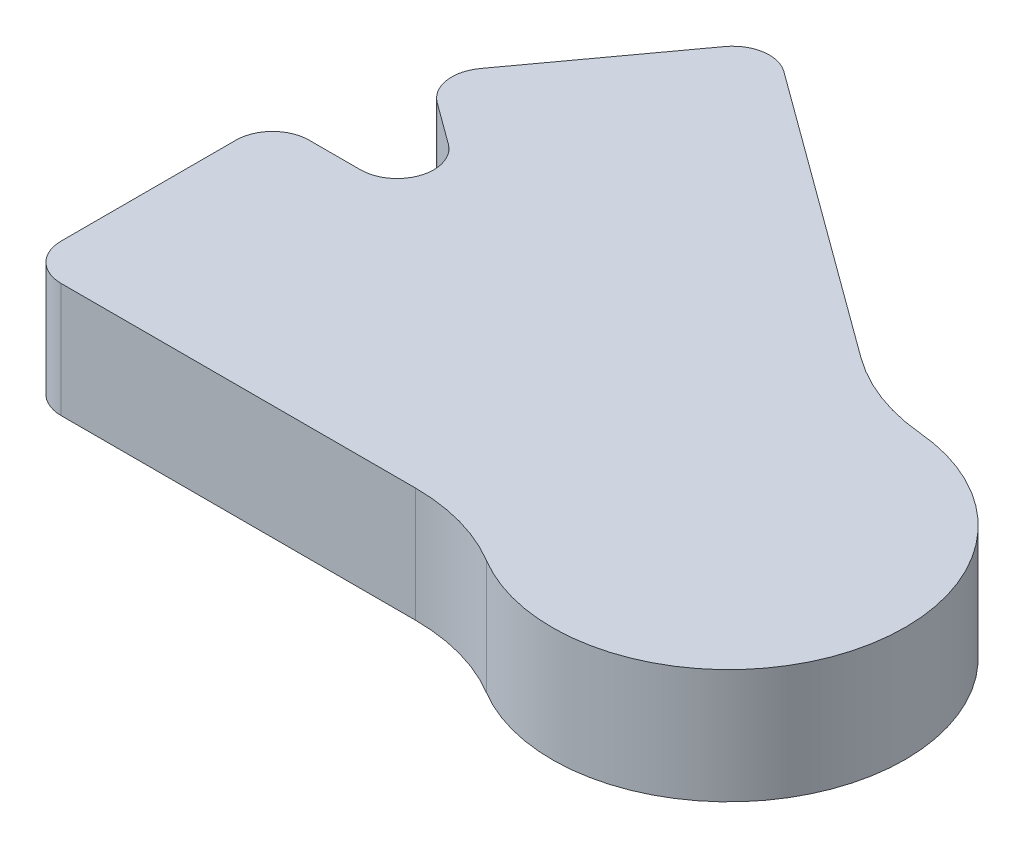
ISO-10303-21;
HEADER;
FILE_DESCRIPTION(('STEP AP214'),'2;1');
FILE_NAME('part.step','',(''),(''),'','','');
FILE_SCHEMA(('AUTOMOTIVE_DESIGN { 1 0 10303 214 1 1 1 1 }'));
ENDSEC;
DATA;
#1=APPLICATION_CONTEXT('core data for automotive mechanical design processes');
#2=APPLICATION_PROTOCOL_DEFINITION('international standard','automotive_design',2000,#1);
#3=PRODUCT_CONTEXT('',#1,'mechanical');
#4=PRODUCT('Part','Part','',(#3));
#5=PRODUCT_RELATED_PRODUCT_CATEGORY('part','',(#4));
#6=PRODUCT_DEFINITION_FORMATION('','',#4);
#7=PRODUCT_DEFINITION_CONTEXT('part definition',#1,'design');
#8=PRODUCT_DEFINITION('design','',#6,#7);
#9=PRODUCT_DEFINITION_SHAPE('','',#8);
#10=(LENGTH_UNIT() NAMED_UNIT(*) SI_UNIT(.MILLI.,.METRE.));
#11=(NAMED_UNIT(*) PLANE_ANGLE_UNIT() SI_UNIT($,.RADIAN.));
#12=(NAMED_UNIT(*) SI_UNIT($,.STERADIAN.) SOLID_ANGLE_UNIT());
#13=UNCERTAINTY_MEASURE_WITH_UNIT(LENGTH_MEASURE(1.E-05),#10,'distance_accuracy_value','');
#14=(GEOMETRIC_REPRESENTATION_CONTEXT(3) GLOBAL_UNCERTAINTY_ASSIGNED_CONTEXT((#13)) GLOBAL_UNIT_ASSIGNED_CONTEXT((#10,
#11,#12)) REPRESENTATION_CONTEXT('',''));
#15=CARTESIAN_POINT('',(0.,0.,0.));
#16=DIRECTION('',(0.,0.,1.));
#17=DIRECTION('',(1.,0.,0.));
#18=AXIS2_PLACEMENT_3D('',#15,#16,#17);
#19=CARTESIAN_POINT('',(-32.2118913233912,-90.0818601749341,-32.5481613448826));
#20=DIRECTION('',(0.,1.,0.));
#21=DIRECTION('',(0.,0.,1.));
#22=AXIS2_PLACEMENT_3D('',#19,#20,#21);
#23=CYLINDRICAL_SURFACE('',#22,3.048);
#24=CARTESIAN_POINT('',(-32.2118913233912,-9.52499999999988,-32.5481613448826));
#25=DIRECTION('',(0.,1.,0.));
#26=DIRECTION('',(0.,0.,1.));
#27=AXIS2_PLACEMENT_3D('',#24,#25,#26);
#28=CIRCLE('',#27,3.048);
#29=CARTESIAN_POINT('',(-34.6727082335879,-9.52499999999987,-34.3466841094007));
#30=VERTEX_POINT('',#29);
#31=CARTESIAN_POINT('',(-30.413368558873,-9.52499999999987,-35.0089782550793));
#32=VERTEX_POINT('',#31);
#33=EDGE_CURVE('E46',#30,#32,#28,.F.);
#34=ORIENTED_EDGE('',*,*,#33,.F.);
#35=DIRECTION('',(0.,1.,0.));
#36=VECTOR('',#35,1.);
#37=CARTESIAN_POINT('',(-34.6727082335879,-90.0818601749341,-34.3466841094007));
#38=LINE('',#37,#36);
#39=CARTESIAN_POINT('',(-34.6727082335879,0.,-34.3466841094007));
#40=VERTEX_POINT('',#39);
#41=EDGE_CURVE('E137',#30,#40,#38,.T.);
#42=ORIENTED_EDGE('',*,*,#41,.T.);
#43=CARTESIAN_POINT('',(-32.2118913233912,0.,-32.5481613448826));
#44=DIRECTION('',(0.,1.,0.));
#45=DIRECTION('',(0.,0.,1.));
#46=AXIS2_PLACEMENT_3D('',#43,#44,#45);
#47=CIRCLE('',#46,3.048);
#48=CARTESIAN_POINT('',(-30.413368558873,0.,-35.0089782550793));
#49=VERTEX_POINT('',#48);
#50=EDGE_CURVE('E141',#49,#40,#47,.T.);
#51=ORIENTED_EDGE('',*,*,#50,.F.);
#52=DIRECTION('',(0.,1.,0.));
#53=VECTOR('',#52,1.);
#54=CARTESIAN_POINT('',(-30.413368558873,-90.0818601749341,-35.0089782550793));
#55=LINE('',#54,#53);
#56=EDGE_CURVE('E194',#32,#49,#55,.T.);
#57=ORIENTED_EDGE('',*,*,#56,.F.);
#58=EDGE_LOOP('',(#34,#42,#51,#57));
#59=FACE_BOUND('',#58,.T.);
#60=ADVANCED_FACE('F39',(#59),#23,.T.);
#61=CARTESIAN_POINT('',(-30.413368558873,-90.0818601749341,-35.0089782550793));
#62=DIRECTION('',(0.590066523792042,0.,-0.807354629329625));
#63=DIRECTION('',(-0.807354629329625,0.,-0.590066523792042));
#64=AXIS2_PLACEMENT_3D('',#61,#62,#63);
#65=PLANE('',#64);
#66=DIRECTION('',(0.807354629329625,0.,0.590066523792042));
#67=VECTOR('',#66,1.);
#68=CARTESIAN_POINT('',(-30.4133685588729,-9.52499999999987,-35.0089782550793));
#69=LINE('',#68,#67);
#70=CARTESIAN_POINT('',(-6.61442698260219,-9.52499999999989,-17.6151859664287));
#71=VERTEX_POINT('',#70);
#72=EDGE_CURVE('E278',#32,#71,#69,.T.);
#73=ORIENTED_EDGE('',*,*,#72,.F.);
#74=ORIENTED_EDGE('',*,*,#56,.T.);
#75=DIRECTION('',(-0.807354629329625,0.,-0.590066523792042));
#76=VECTOR('',#75,1.);
#77=CARTESIAN_POINT('',(-30.413368558873,0.,-35.0089782550793));
#78=LINE('',#77,#76);
#79=CARTESIAN_POINT('',(-6.61442698260222,0.,-17.6151859664287));
#80=VERTEX_POINT('',#79);
#81=EDGE_CURVE('E146',#80,#49,#78,.T.);
#82=ORIENTED_EDGE('',*,*,#81,.F.);
#83=DIRECTION('',(0.,1.,0.));
#84=VECTOR('',#83,1.);
#85=CARTESIAN_POINT('',(-6.61442698260222,-90.0818601749341,-17.6151859664287));
#86=LINE('',#85,#84);
#87=EDGE_CURVE('E197',#71,#80,#86,.T.);
#88=ORIENTED_EDGE('',*,*,#87,.F.);
#89=EDGE_LOOP('',(#73,#74,#82,#88));
#90=FACE_BOUND('',#89,.T.);
#91=ADVANCED_FACE('F277',(#90),#65,.T.);
#92=CARTESIAN_POINT('',(2.75287908259558,-90.0818601749341,-30.4319407070353));
#93=DIRECTION('',(0.,1.,0.));
#94=DIRECTION('',(0.,0.,1.));
#95=AXIS2_PLACEMENT_3D('',#92,#93,#94);
#96=CYLINDRICAL_SURFACE('',#95,15.8749999999985);
#97=CARTESIAN_POINT('',(2.75287908259558,-9.52499999999976,-30.4319407070353));
#98=DIRECTION('',(0.,1.,0.));
#99=DIRECTION('',(0.,0.,1.));
#100=AXIS2_PLACEMENT_3D('',#97,#98,#99);
#101=CIRCLE('',#100,15.8749999999985);
#102=CARTESIAN_POINT('',(1.32266343286802,-9.52499999999988,-14.6214976963153));
#103=VERTEX_POINT('',#102);
#104=EDGE_CURVE('E279',#71,#103,#101,.T.);
#105=ORIENTED_EDGE('',*,*,#104,.F.);
#106=ORIENTED_EDGE('',*,*,#87,.T.);
#107=CARTESIAN_POINT('',(2.75287908259558,0.,-30.4319407070353));
#108=DIRECTION('',(0.,-1.,0.));
#109=DIRECTION('',(0.,0.,1.));
#110=AXIS2_PLACEMENT_3D('',#107,#108,#109);
#111=CIRCLE('',#110,15.8749999999985);
#112=CARTESIAN_POINT('',(1.32266343286801,0.,-14.6214976963153));
#113=VERTEX_POINT('',#112);
#114=EDGE_CURVE('E191',#113,#80,#111,.T.);
#115=ORIENTED_EDGE('',*,*,#114,.F.);
#116=DIRECTION('',(0.,1.,0.));
#117=VECTOR('',#116,1.);
#118=CARTESIAN_POINT('',(1.32266343286801,-90.0818601749341,-14.6214976963153));
#119=LINE('',#118,#117);
#120=EDGE_CURVE('E199',#103,#113,#119,.T.);
#121=ORIENTED_EDGE('',*,*,#120,.F.);
#122=EDGE_LOOP('',(#105,#106,#115,#121));
#123=FACE_BOUND('',#122,.T.);
#124=ADVANCED_FACE('F273',(#123),#96,.F.);
#125=CARTESIAN_POINT('',(0.,-90.0818601749341,0.));
#126=DIRECTION('',(0.,1.,0.));
#127=DIRECTION('',(0.,0.,1.));
#128=AXIS2_PLACEMENT_3D('',#125,#126,#127);
#129=CYLINDRICAL_SURFACE('',#128,14.6812);
#130=CARTESIAN_POINT('',(0.,-9.52499999999999,0.));
#131=DIRECTION('',(0.,1.,0.));
#132=DIRECTION('',(0.,0.,1.));
#133=AXIS2_PLACEMENT_3D('',#130,#131,#132);
#134=CIRCLE('',#133,14.6812);
#135=CARTESIAN_POINT('',(-7.55979787272692,-9.52500000000011,12.585193266832));
#136=VERTEX_POINT('',#135);
#137=EDGE_CURVE('E270',#103,#136,#134,.F.);
#138=ORIENTED_EDGE('',*,*,#137,.F.);
#139=ORIENTED_EDGE('',*,*,#120,.T.);
#140=CARTESIAN_POINT('',(0.,0.,0.));
#141=DIRECTION('',(0.,1.,0.));
#142=DIRECTION('',(0.,0.,1.));
#143=AXIS2_PLACEMENT_3D('',#140,#141,#142);
#144=CIRCLE('',#143,14.6812);
#145=CARTESIAN_POINT('',(-7.55979787272692,0.,12.585193266832));
#146=VERTEX_POINT('',#145);
#147=EDGE_CURVE('E188',#146,#113,#144,.T.);
#148=ORIENTED_EDGE('',*,*,#147,.F.);
#149=DIRECTION('',(0.,1.,0.));
#150=VECTOR('',#149,1.);
#151=CARTESIAN_POINT('',(-7.55979787272692,-90.0818601749341,12.585193266832));
#152=LINE('',#151,#150);
#153=EDGE_CURVE('E201',#136,#146,#152,.T.);
#154=ORIENTED_EDGE('',*,*,#153,.F.);
#155=EDGE_LOOP('',(#138,#139,#148,#154));
#156=FACE_BOUND('',#155,.T.);
#157=ADVANCED_FACE('F267',(#156),#129,.T.);
#158=CARTESIAN_POINT('',(-15.7343197939273,-90.0818601749341,26.1937499999967));
#159=DIRECTION('',(0.,1.,0.));
#160=DIRECTION('',(0.,0.,1.));
#161=AXIS2_PLACEMENT_3D('',#158,#159,#160);
#162=CYLINDRICAL_SURFACE('',#161,15.8749999999984);
#163=CARTESIAN_POINT('',(-15.7343197939273,-9.52500000000024,26.1937499999967));
#164=DIRECTION('',(0.,1.,0.));
#165=DIRECTION('',(0.,0.,1.));
#166=AXIS2_PLACEMENT_3D('',#163,#164,#165);
#167=CIRCLE('',#166,15.8749999999984);
#168=CARTESIAN_POINT('',(-15.7343197939273,-9.52500000000012,10.3187499999983));
#169=VERTEX_POINT('',#168);
#170=EDGE_CURVE('E264',#136,#169,#167,.T.);
#171=ORIENTED_EDGE('',*,*,#170,.F.);
#172=ORIENTED_EDGE('',*,*,#153,.T.);
#173=CARTESIAN_POINT('',(-15.7343197939273,0.,26.1937499999967));
#174=DIRECTION('',(0.,-1.,0.));
#175=DIRECTION('',(0.,0.,1.));
#176=AXIS2_PLACEMENT_3D('',#173,#174,#175);
#177=CIRCLE('',#176,15.8749999999984);
#178=CARTESIAN_POINT('',(-15.7343197939273,0.,10.3187499999983));
#179=VERTEX_POINT('',#178);
#180=EDGE_CURVE('E185',#179,#146,#177,.T.);
#181=ORIENTED_EDGE('',*,*,#180,.F.);
#182=DIRECTION('',(0.,1.,0.));
#183=VECTOR('',#182,1.);
#184=CARTESIAN_POINT('',(-15.7343197939273,-90.0818601749341,10.3187499999983));
#185=LINE('',#184,#183);
#186=EDGE_CURVE('E203',#169,#179,#185,.T.);
#187=ORIENTED_EDGE('',*,*,#186,.F.);
#188=EDGE_LOOP('',(#171,#172,#181,#187));
#189=FACE_BOUND('',#188,.T.);
#190=ADVANCED_FACE('F262',(#189),#162,.F.);
#191=CARTESIAN_POINT('',(-15.7343197939273,-90.0818601749341,10.3187499999983));
#192=DIRECTION('',(0.,0.,1.));
#193=DIRECTION('',(1.,0.,0.));
#194=AXIS2_PLACEMENT_3D('',#191,#192,#193);
#195=PLANE('',#194);
#196=DIRECTION('',(-1.,0.,0.));
#197=VECTOR('',#196,1.);
#198=CARTESIAN_POINT('',(-15.7343197939276,-9.52500000000012,10.3187499999983));
#199=LINE('',#198,#197);
#200=CARTESIAN_POINT('',(-45.2119999999998,-9.52500000000025,10.3187499999983));
#201=VERTEX_POINT('',#200);
#202=EDGE_CURVE('E284',#169,#201,#199,.T.);
#203=ORIENTED_EDGE('',*,*,#202,.F.);
#204=ORIENTED_EDGE('',*,*,#186,.T.);
#205=DIRECTION('',(1.,0.,0.));
#206=VECTOR('',#205,1.);
#207=CARTESIAN_POINT('',(-15.7343197939273,0.,10.3187499999983));
#208=LINE('',#207,#206);
#209=CARTESIAN_POINT('',(-45.2119999999998,0.,10.3187499999983));
#210=VERTEX_POINT('',#209);
#211=EDGE_CURVE('E182',#210,#179,#208,.T.);
#212=ORIENTED_EDGE('',*,*,#211,.F.);
#213=DIRECTION('',(0.,1.,0.));
#214=VECTOR('',#213,1.);
#215=CARTESIAN_POINT('',(-45.2119999999998,-90.0818601749341,10.3187499999983));
#216=LINE('',#215,#214);
#217=EDGE_CURVE('E205',#201,#210,#216,.T.);
#218=ORIENTED_EDGE('',*,*,#217,.F.);
#219=EDGE_LOOP('',(#203,#204,#212,#218));
#220=FACE_BOUND('',#219,.T.);
#221=ADVANCED_FACE('F256',(#220),#195,.T.);
#222=CARTESIAN_POINT('',(-45.2119999999998,-90.0818601749341,7.27074999999827));
#223=DIRECTION('',(0.,1.,0.));
#224=DIRECTION('',(0.,0.,1.));
#225=AXIS2_PLACEMENT_3D('',#222,#223,#224);
#226=CYLINDRICAL_SURFACE('',#225,3.048);
#227=CARTESIAN_POINT('',(-45.2119999999998,-9.52500000000023,7.27074999999827));
#228=DIRECTION('',(0.,1.,0.));
#229=DIRECTION('',(0.,0.,1.));
#230=AXIS2_PLACEMENT_3D('',#227,#228,#229);
#231=CIRCLE('',#230,3.048);
#232=CARTESIAN_POINT('',(-48.2599999999998,-9.52500000000024,7.27074999999827));
#233=VERTEX_POINT('',#232);
#234=EDGE_CURVE('E253',#201,#233,#231,.F.);
#235=ORIENTED_EDGE('',*,*,#234,.F.);
#236=ORIENTED_EDGE('',*,*,#217,.T.);
#237=CARTESIAN_POINT('',(-45.2119999999998,0.,7.27074999999827));
#238=DIRECTION('',(0.,1.,0.));
#239=DIRECTION('',(0.,0.,1.));
#240=AXIS2_PLACEMENT_3D('',#237,#238,#239);
#241=CIRCLE('',#240,3.048);
#242=CARTESIAN_POINT('',(-48.2599999999998,0.,7.27074999999827));
#243=VERTEX_POINT('',#242);
#244=EDGE_CURVE('E179',#243,#210,#241,.T.);
#245=ORIENTED_EDGE('',*,*,#244,.F.);
#246=DIRECTION('',(0.,1.,0.));
#247=VECTOR('',#246,1.);
#248=CARTESIAN_POINT('',(-48.2599999999998,-90.0818601749341,7.27074999999827));
#249=LINE('',#248,#247);
#250=EDGE_CURVE('E207',#233,#243,#249,.T.);
#251=ORIENTED_EDGE('',*,*,#250,.F.);
#252=EDGE_LOOP('',(#235,#236,#245,#251));
#253=FACE_BOUND('',#252,.T.);
#254=ADVANCED_FACE('F250',(#253),#226,.T.);
#255=CARTESIAN_POINT('',(-48.2599999999998,-90.0818601749341,7.27074999999827));
#256=DIRECTION('',(-1.,0.,0.));
#257=DIRECTION('',(0.,0.,1.));
#258=AXIS2_PLACEMENT_3D('',#255,#256,#257);
#259=PLANE('',#258);
#260=DIRECTION('',(0.,0.,-1.));
#261=VECTOR('',#260,1.);
#262=CARTESIAN_POINT('',(-48.2599999999998,-9.52500000000024,7.27074999999886));
#263=LINE('',#262,#261);
#264=CARTESIAN_POINT('',(-48.2599999999999,-9.52500000000013,-7.2707499999985));
#265=VERTEX_POINT('',#264);
#266=EDGE_CURVE('E247',#233,#265,#263,.T.);
#267=ORIENTED_EDGE('',*,*,#266,.F.);
#268=ORIENTED_EDGE('',*,*,#250,.T.);
#269=DIRECTION('',(0.,0.,1.));
#270=VECTOR('',#269,1.);
#271=CARTESIAN_POINT('',(-48.2599999999998,0.,7.27074999999827));
#272=LINE('',#271,#270);
#273=CARTESIAN_POINT('',(-48.2599999999999,0.,-7.2707499999985));
#274=VERTEX_POINT('',#273);
#275=EDGE_CURVE('E176',#274,#243,#272,.T.);
#276=ORIENTED_EDGE('',*,*,#275,.F.);
#277=DIRECTION('',(0.,1.,0.));
#278=VECTOR('',#277,1.);
#279=CARTESIAN_POINT('',(-48.2599999999999,-90.0818601749341,-7.2707499999985));
#280=LINE('',#279,#278);
#281=EDGE_CURVE('E209',#265,#274,#280,.T.);
#282=ORIENTED_EDGE('',*,*,#281,.F.);
#283=EDGE_LOOP('',(#267,#268,#276,#282));
#284=FACE_BOUND('',#283,.T.);
#285=ADVANCED_FACE('F245',(#284),#259,.T.);
#286=CARTESIAN_POINT('',(-45.2119999999999,-90.0818601749341,-7.27074999999851));
#287=DIRECTION('',(0.,1.,0.));
#288=DIRECTION('',(0.,0.,1.));
#289=AXIS2_PLACEMENT_3D('',#286,#287,#288);
#290=CYLINDRICAL_SURFACE('',#289,3.048);
#291=CARTESIAN_POINT('',(-45.2119999999999,-9.52500000000012,-7.27074999999851));
#292=DIRECTION('',(0.,1.,0.));
#293=DIRECTION('',(0.,0.,1.));
#294=AXIS2_PLACEMENT_3D('',#291,#292,#293);
#295=CIRCLE('',#294,3.048);
#296=CARTESIAN_POINT('',(-45.2119999999998,-9.5250000000001,-10.3187499999985));
#297=VERTEX_POINT('',#296);
#298=EDGE_CURVE('E288',#265,#297,#295,.F.);
#299=ORIENTED_EDGE('',*,*,#298,.F.);
#300=ORIENTED_EDGE('',*,*,#281,.T.);
#301=CARTESIAN_POINT('',(-45.2119999999999,0.,-7.27074999999851));
#302=DIRECTION('',(0.,1.,0.));
#303=DIRECTION('',(0.,0.,1.));
#304=AXIS2_PLACEMENT_3D('',#301,#302,#303);
#305=CIRCLE('',#304,3.048);
#306=CARTESIAN_POINT('',(-45.2119999999998,0.,-10.3187499999985));
#307=VERTEX_POINT('',#306);
#308=EDGE_CURVE('E173',#307,#274,#305,.T.);
#309=ORIENTED_EDGE('',*,*,#308,.F.);
#310=DIRECTION('',(0.,1.,0.));
#311=VECTOR('',#310,1.);
#312=CARTESIAN_POINT('',(-45.2119999999998,-90.0818601749341,-10.3187499999985));
#313=LINE('',#312,#311);
#314=EDGE_CURVE('E211',#297,#307,#313,.T.);
#315=ORIENTED_EDGE('',*,*,#314,.F.);
#316=EDGE_LOOP('',(#299,#300,#309,#315));
#317=FACE_BOUND('',#316,.T.);
#318=ADVANCED_FACE('F239',(#317),#290,.T.);
#319=CARTESIAN_POINT('',(-45.2119999999998,-90.0818601749341,-10.3187499999985));
#320=DIRECTION('',(0.,0.,-1.));
#321=DIRECTION('',(-1.,0.,0.));
#322=AXIS2_PLACEMENT_3D('',#319,#320,#321);
#323=PLANE('',#322);
#324=DIRECTION('',(1.,0.,0.));
#325=VECTOR('',#324,1.);
#326=CARTESIAN_POINT('',(-45.2120000000002,-9.5250000000001,-10.3187499999985));
#327=LINE('',#326,#325);
#328=CARTESIAN_POINT('',(-40.9419218299925,-9.52500000000007,-10.3187499999985));
#329=VERTEX_POINT('',#328);
#330=EDGE_CURVE('E236',#297,#329,#327,.T.);
#331=ORIENTED_EDGE('',*,*,#330,.F.);
#332=ORIENTED_EDGE('',*,*,#314,.T.);
#333=DIRECTION('',(-1.,0.,0.));
#334=VECTOR('',#333,1.);
#335=CARTESIAN_POINT('',(-45.2119999999998,0.,-10.3187499999985));
#336=LINE('',#335,#334);
#337=CARTESIAN_POINT('',(-40.9419218299925,0.,-10.3187499999985));
#338=VERTEX_POINT('',#337);
#339=EDGE_CURVE('E170',#338,#307,#336,.T.);
#340=ORIENTED_EDGE('',*,*,#339,.F.);
#341=DIRECTION('',(0.,1.,0.));
#342=VECTOR('',#341,1.);
#343=CARTESIAN_POINT('',(-40.9419218299925,-90.0818601749341,-10.3187499999985));
#344=LINE('',#343,#342);
#345=EDGE_CURVE('E213',#329,#338,#344,.T.);
#346=ORIENTED_EDGE('',*,*,#345,.F.);
#347=EDGE_LOOP('',(#331,#332,#340,#346));
#348=FACE_BOUND('',#347,.T.);
#349=ADVANCED_FACE('F233',(#348),#323,.T.);
#350=CARTESIAN_POINT('',(-40.9419218299925,-90.0818601749341,-13.3667499999985));
#351=DIRECTION('',(0.,1.,0.));
#352=DIRECTION('',(0.,0.,1.));
#353=AXIS2_PLACEMENT_3D('',#350,#351,#352);
#354=CYLINDRICAL_SURFACE('',#353,3.04799999999999);
#355=CARTESIAN_POINT('',(-40.9419218299925,-9.52500000000005,-13.3667499999985));
#356=DIRECTION('',(0.,1.,0.));
#357=DIRECTION('',(0.,0.,1.));
#358=AXIS2_PLACEMENT_3D('',#355,#356,#357);
#359=CIRCLE('',#358,3.04799999999999);
#360=CARTESIAN_POINT('',(-39.1433990654744,-9.52500000000003,-15.8275669101952));
#361=VERTEX_POINT('',#360);
#362=EDGE_CURVE('E58',#329,#361,#359,.T.);
#363=ORIENTED_EDGE('',*,*,#362,.F.);
#364=ORIENTED_EDGE('',*,*,#345,.T.);
#365=CARTESIAN_POINT('',(-40.9419218299925,0.,-13.3667499999985));
#366=DIRECTION('',(0.,-1.,0.));
#367=DIRECTION('',(0.,0.,1.));
#368=AXIS2_PLACEMENT_3D('',#365,#366,#367);
#369=CIRCLE('',#368,3.04799999999999);
#370=CARTESIAN_POINT('',(-39.1433990654744,0.,-15.8275669101952));
#371=VERTEX_POINT('',#370);
#372=EDGE_CURVE('E167',#371,#338,#369,.T.);
#373=ORIENTED_EDGE('',*,*,#372,.F.);
#374=DIRECTION('',(0.,1.,0.));
#375=VECTOR('',#374,1.);
#376=CARTESIAN_POINT('',(-39.1433990654744,-90.0818601749341,-15.8275669101952));
#377=LINE('',#376,#375);
#378=EDGE_CURVE('E215',#361,#371,#377,.T.);
#379=ORIENTED_EDGE('',*,*,#378,.F.);
#380=EDGE_LOOP('',(#363,#364,#373,#379));
#381=FACE_BOUND('',#380,.T.);
#382=ADVANCED_FACE('F229',(#381),#354,.F.);
#383=CARTESIAN_POINT('',(-42.5908664436292,-90.0818601749341,-18.3471970922917));
#384=DIRECTION('',(-0.590066523792036,0.,0.807354629329629));
#385=DIRECTION('',(0.807354629329629,0.,0.590066523792036));
#386=AXIS2_PLACEMENT_3D('',#383,#384,#385);
#387=PLANE('',#386);
#388=DIRECTION('',(-0.807354629329629,0.,-0.590066523792036));
#389=VECTOR('',#388,1.);
#390=CARTESIAN_POINT('',(-42.5908664436292,-9.52500000000002,-18.3471970922917));
#391=LINE('',#390,#389);
#392=CARTESIAN_POINT('',(-42.5908664436292,-9.52500000000002,-18.3471970922917));
#393=VERTEX_POINT('',#392);
#394=EDGE_CURVE('E53',#361,#393,#391,.T.);
#395=ORIENTED_EDGE('',*,*,#394,.F.);
#396=ORIENTED_EDGE('',*,*,#378,.T.);
#397=DIRECTION('',(0.807354629329629,0.,0.590066523792036));
#398=VECTOR('',#397,1.);
#399=CARTESIAN_POINT('',(-42.5908664436292,0.,-18.3471970922917));
#400=LINE('',#399,#398);
#401=CARTESIAN_POINT('',(-42.5908664436292,0.,-18.3471970922917));
#402=VERTEX_POINT('',#401);
#403=EDGE_CURVE('E164',#402,#371,#400,.T.);
#404=ORIENTED_EDGE('',*,*,#403,.F.);
#405=DIRECTION('',(0.,1.,0.));
#406=VECTOR('',#405,1.);
#407=CARTESIAN_POINT('',(-42.5908664436292,-90.0818601749341,-18.3471970922917));
#408=LINE('',#407,#406);
#409=EDGE_CURVE('E217',#393,#402,#408,.T.);
#410=ORIENTED_EDGE('',*,*,#409,.F.);
#411=EDGE_LOOP('',(#395,#396,#404,#410));
#412=FACE_BOUND('',#411,.T.);
#413=ADVANCED_FACE('F224',(#412),#387,.T.);
#414=CARTESIAN_POINT('',(-40.7923436791111,-90.0818601749341,-20.8080140024884));
#415=DIRECTION('',(0.,1.,0.));
#416=DIRECTION('',(0.,0.,1.));
#417=AXIS2_PLACEMENT_3D('',#414,#415,#416);
#418=CYLINDRICAL_SURFACE('',#417,3.048);
#419=CARTESIAN_POINT('',(-40.7923436791111,-9.52499999999999,-20.8080140024884));
#420=DIRECTION('',(0.,1.,0.));
#421=DIRECTION('',(0.,0.,1.));
#422=AXIS2_PLACEMENT_3D('',#419,#420,#421);
#423=CIRCLE('',#422,3.048);
#424=CARTESIAN_POINT('',(-43.2531605893078,-9.52499999999994,-22.6065367670066));
#425=VERTEX_POINT('',#424);
#426=EDGE_CURVE('E196',#393,#425,#423,.F.);
#427=ORIENTED_EDGE('',*,*,#426,.F.);
#428=ORIENTED_EDGE('',*,*,#409,.T.);
#429=CARTESIAN_POINT('',(-40.7923436791111,0.,-20.8080140024884));
#430=DIRECTION('',(0.,1.,0.));
#431=DIRECTION('',(0.,0.,1.));
#432=AXIS2_PLACEMENT_3D('',#429,#430,#431);
#433=CIRCLE('',#432,3.048);
#434=CARTESIAN_POINT('',(-43.2531605893078,0.,-22.6065367670066));
#435=VERTEX_POINT('',#434);
#436=EDGE_CURVE('E154',#435,#402,#433,.T.);
#437=ORIENTED_EDGE('',*,*,#436,.F.);
#438=DIRECTION('',(0.,1.,0.));
#439=VECTOR('',#438,1.);
#440=CARTESIAN_POINT('',(-43.2531605893078,-90.0818601749341,-22.6065367670066));
#441=LINE('',#440,#439);
#442=EDGE_CURVE('E145',#425,#435,#441,.T.);
#443=ORIENTED_EDGE('',*,*,#442,.F.);
#444=EDGE_LOOP('',(#427,#428,#437,#443));
#445=FACE_BOUND('',#444,.T.);
#446=ADVANCED_FACE('F222',(#445),#418,.T.);
#447=CARTESIAN_POINT('',(-43.2531605893078,-90.0818601749341,-22.6065367670066));
#448=DIRECTION('',(-0.80735462932963,0.,-0.590066523792035));
#449=DIRECTION('',(-0.590066523792035,0.,0.80735462932963));
#450=AXIS2_PLACEMENT_3D('',#447,#448,#449);
#451=PLANE('',#450);
#452=DIRECTION('',(0.590066523792035,0.,-0.80735462932963));
#453=VECTOR('',#452,1.);
#454=CARTESIAN_POINT('',(-43.2531605893082,-9.52499999999999,-22.606536767006));
#455=LINE('',#454,#453);
#456=EDGE_CURVE('E11',#425,#30,#455,.T.);
#457=ORIENTED_EDGE('',*,*,#456,.F.);
#458=ORIENTED_EDGE('',*,*,#442,.T.);
#459=DIRECTION('',(-0.590066523792035,0.,0.80735462932963));
#460=VECTOR('',#459,1.);
#461=CARTESIAN_POINT('',(-43.2531605893078,0.,-22.6065367670066));
#462=LINE('',#461,#460);
#463=EDGE_CURVE('E148',#40,#435,#462,.T.);
#464=ORIENTED_EDGE('',*,*,#463,.F.);
#465=ORIENTED_EDGE('',*,*,#41,.F.);
#466=EDGE_LOOP('',(#457,#458,#464,#465));
#467=FACE_BOUND('',#466,.T.);
#468=ADVANCED_FACE('F149',(#467),#451,.T.);
#469=CARTESIAN_POINT('',(-32.2118913233912,0.,-32.5481613448826));
#470=DIRECTION('',(0.,1.,0.));
#471=DIRECTION('',(0.,0.,1.));
#472=AXIS2_PLACEMENT_3D('',#469,#470,#471);
#473=PLANE('',#472);
#474=ORIENTED_EDGE('',*,*,#50,.T.);
#475=ORIENTED_EDGE('',*,*,#463,.T.);
#476=ORIENTED_EDGE('',*,*,#436,.T.);
#477=ORIENTED_EDGE('',*,*,#403,.T.);
#478=ORIENTED_EDGE('',*,*,#372,.T.);
#479=ORIENTED_EDGE('',*,*,#339,.T.);
#480=ORIENTED_EDGE('',*,*,#308,.T.);
#481=ORIENTED_EDGE('',*,*,#275,.T.);
#482=ORIENTED_EDGE('',*,*,#244,.T.);
#483=ORIENTED_EDGE('',*,*,#211,.T.);
#484=ORIENTED_EDGE('',*,*,#180,.T.);
#485=ORIENTED_EDGE('',*,*,#147,.T.);
#486=ORIENTED_EDGE('',*,*,#114,.T.);
#487=ORIENTED_EDGE('',*,*,#81,.T.);
#488=EDGE_LOOP('',(#474,#475,#476,#477,#478,#479,#480,#481,#482,#483,#484,#485,#486,#487));
#489=FACE_BOUND('',#488,.T.);
#490=ADVANCED_FACE('F156',(#489),#473,.T.);
#491=CARTESIAN_POINT('',(0.,-9.52499999999999,0.));
#492=DIRECTION('',(0.,1.,0.));
#493=DIRECTION('',(-0.950619437348518,0.,-0.310358962066808));
#494=AXIS2_PLACEMENT_3D('',#491,#492,#493);
#495=PLANE('',#494);
#496=ORIENTED_EDGE('',*,*,#33,.T.);
#497=ORIENTED_EDGE('',*,*,#72,.T.);
#498=ORIENTED_EDGE('',*,*,#104,.T.);
#499=ORIENTED_EDGE('',*,*,#137,.T.);
#500=ORIENTED_EDGE('',*,*,#170,.T.);
#501=ORIENTED_EDGE('',*,*,#202,.T.);
#502=ORIENTED_EDGE('',*,*,#234,.T.);
#503=ORIENTED_EDGE('',*,*,#266,.T.);
#504=ORIENTED_EDGE('',*,*,#298,.T.);
#505=ORIENTED_EDGE('',*,*,#330,.T.);
#506=ORIENTED_EDGE('',*,*,#362,.T.);
#507=ORIENTED_EDGE('',*,*,#394,.T.);
#508=ORIENTED_EDGE('',*,*,#426,.T.);
#509=ORIENTED_EDGE('',*,*,#456,.T.);
#510=EDGE_LOOP('',(#496,#497,#498,#499,#500,#501,#502,#503,#504,#505,#506,#507,#508,#509));
#511=FACE_BOUND('',#510,.T.);
#512=ADVANCED_FACE('F293',(#511),#495,.F.);
#513=CLOSED_SHELL('',(#60,#91,#124,#157,#190,#221,#254,#285,#318,#349,#382,#413,#446,#468,#490,#512));
#514=MANIFOLD_SOLID_BREP('B2',#513);
#515=ADVANCED_BREP_SHAPE_REPRESENTATION('',(#18,#514),#14);
#516=SHAPE_DEFINITION_REPRESENTATION(#9,#515);
ENDSEC;
END-ISO-10303-21;
